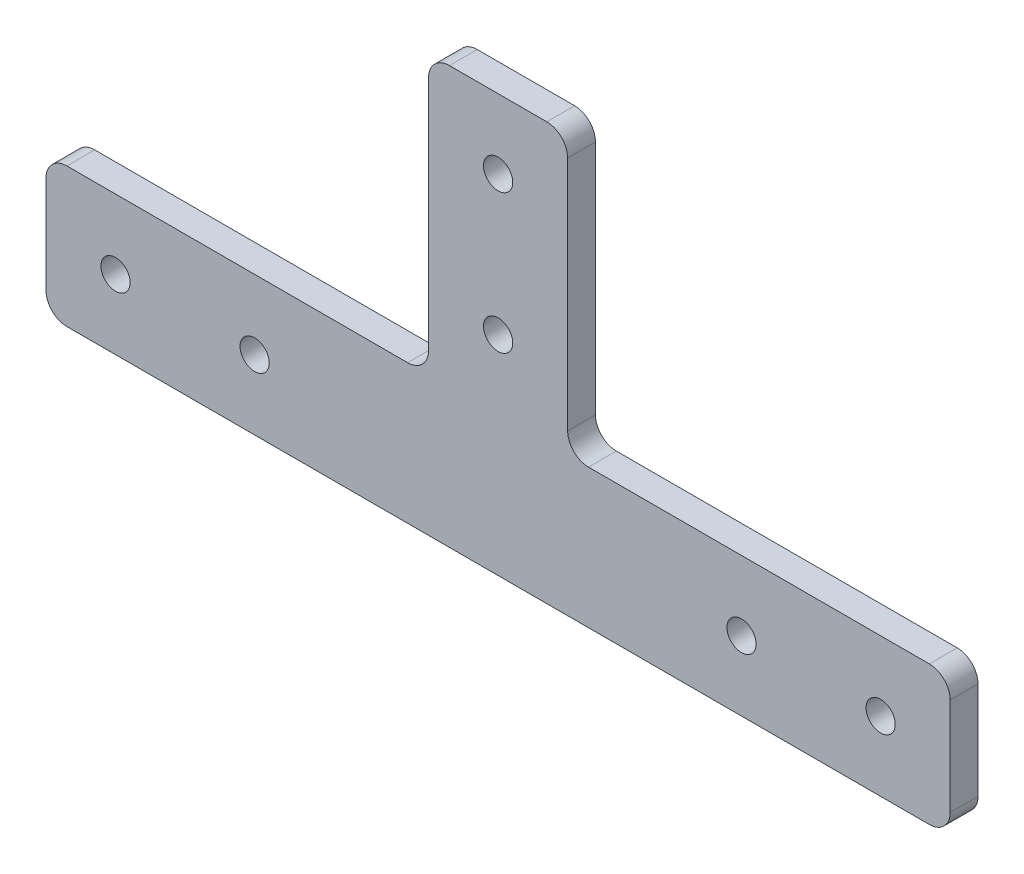
ISO-10303-21;
HEADER;
FILE_DESCRIPTION(('STEP AP214'),'2;1');
FILE_NAME('part.step','',(''),(''),'','','');
FILE_SCHEMA(('AUTOMOTIVE_DESIGN { 1 0 10303 214 1 1 1 1 }'));
ENDSEC;
DATA;
#1=APPLICATION_CONTEXT('core data for automotive mechanical design processes');
#2=APPLICATION_PROTOCOL_DEFINITION('international standard','automotive_design',2000,#1);
#3=PRODUCT_CONTEXT('',#1,'mechanical');
#4=PRODUCT('Part','Part','',(#3));
#5=PRODUCT_RELATED_PRODUCT_CATEGORY('part','',(#4));
#6=PRODUCT_DEFINITION_FORMATION('','',#4);
#7=PRODUCT_DEFINITION_CONTEXT('part definition',#1,'design');
#8=PRODUCT_DEFINITION('design','',#6,#7);
#9=PRODUCT_DEFINITION_SHAPE('','',#8);
#10=(LENGTH_UNIT() NAMED_UNIT(*) SI_UNIT(.MILLI.,.METRE.));
#11=(NAMED_UNIT(*) PLANE_ANGLE_UNIT() SI_UNIT($,.RADIAN.));
#12=(NAMED_UNIT(*) SI_UNIT($,.STERADIAN.) SOLID_ANGLE_UNIT());
#13=UNCERTAINTY_MEASURE_WITH_UNIT(LENGTH_MEASURE(1.E-05),#10,'distance_accuracy_value','');
#14=(GEOMETRIC_REPRESENTATION_CONTEXT(3) GLOBAL_UNCERTAINTY_ASSIGNED_CONTEXT((#13)) GLOBAL_UNIT_ASSIGNED_CONTEXT((#10,
#11,#12)) REPRESENTATION_CONTEXT('',''));
#15=CARTESIAN_POINT('',(0.,0.,0.));
#16=DIRECTION('',(0.,0.,1.));
#17=DIRECTION('',(1.,0.,0.));
#18=AXIS2_PLACEMENT_3D('',#15,#16,#17);
#19=CARTESIAN_POINT('',(65.,0.,4.));
#20=DIRECTION('',(1.,0.,0.));
#21=DIRECTION('',(0.,0.,-1.));
#22=AXIS2_PLACEMENT_3D('',#19,#20,#21);
#23=PLANE('',#22);
#24=DIRECTION('',(0.,-1.,0.));
#25=VECTOR('',#24,1.);
#26=CARTESIAN_POINT('',(65.,0.,4.));
#27=LINE('',#26,#25);
#28=CARTESIAN_POINT('',(65.,7.,4.));
#29=VERTEX_POINT('',#28);
#30=CARTESIAN_POINT('',(65.,-7.,4.));
#31=VERTEX_POINT('',#30);
#32=EDGE_CURVE('E336',#29,#31,#27,.T.);
#33=ORIENTED_EDGE('',*,*,#32,.T.);
#34=DIRECTION('',(0.,0.,-1.));
#35=VECTOR('',#34,1.);
#36=CARTESIAN_POINT('',(65.,-7.,0.));
#37=LINE('',#36,#35);
#38=CARTESIAN_POINT('',(65.,-7.,0.));
#39=VERTEX_POINT('',#38);
#40=EDGE_CURVE('E261',#31,#39,#37,.T.);
#41=ORIENTED_EDGE('',*,*,#40,.T.);
#42=DIRECTION('',(0.,-1.,0.));
#43=VECTOR('',#42,1.);
#44=CARTESIAN_POINT('',(65.,0.,0.));
#45=LINE('',#44,#43);
#46=CARTESIAN_POINT('',(65.,7.,0.));
#47=VERTEX_POINT('',#46);
#48=EDGE_CURVE('E314',#47,#39,#45,.T.);
#49=ORIENTED_EDGE('',*,*,#48,.F.);
#50=DIRECTION('',(0.,0.,-1.));
#51=VECTOR('',#50,1.);
#52=CARTESIAN_POINT('',(65.,7.,4.));
#53=LINE('',#52,#51);
#54=EDGE_CURVE('E258',#47,#29,#53,.F.);
#55=ORIENTED_EDGE('',*,*,#54,.T.);
#56=EDGE_LOOP('',(#33,#41,#49,#55));
#57=FACE_BOUND('',#56,.T.);
#58=ADVANCED_FACE('F45',(#57),#23,.T.);
#59=CARTESIAN_POINT('',(0.,10.,4.));
#60=DIRECTION('',(0.,1.,0.));
#61=DIRECTION('',(0.,0.,1.));
#62=AXIS2_PLACEMENT_3D('',#59,#60,#61);
#63=PLANE('',#62);
#64=DIRECTION('',(1.,0.,0.));
#65=VECTOR('',#64,1.);
#66=CARTESIAN_POINT('',(0.,10.,4.));
#67=LINE('',#66,#65);
#68=CARTESIAN_POINT('',(13.,10.,4.));
#69=VERTEX_POINT('',#68);
#70=CARTESIAN_POINT('',(62.,10.,4.));
#71=VERTEX_POINT('',#70);
#72=EDGE_CURVE('E324',#69,#71,#67,.T.);
#73=ORIENTED_EDGE('',*,*,#72,.T.);
#74=DIRECTION('',(0.,0.,-1.));
#75=VECTOR('',#74,1.);
#76=CARTESIAN_POINT('',(62.,10.,4.));
#77=LINE('',#76,#75);
#78=CARTESIAN_POINT('',(62.,10.,0.));
#79=VERTEX_POINT('',#78);
#80=EDGE_CURVE('E268',#71,#79,#77,.T.);
#81=ORIENTED_EDGE('',*,*,#80,.T.);
#82=DIRECTION('',(1.,0.,0.));
#83=VECTOR('',#82,1.);
#84=CARTESIAN_POINT('',(0.,10.,0.));
#85=LINE('',#84,#83);
#86=CARTESIAN_POINT('',(13.,10.,0.));
#87=VERTEX_POINT('',#86);
#88=EDGE_CURVE('E303',#87,#79,#85,.T.);
#89=ORIENTED_EDGE('',*,*,#88,.F.);
#90=DIRECTION('',(0.,0.,-1.));
#91=VECTOR('',#90,1.);
#92=CARTESIAN_POINT('',(13.,10.,4.));
#93=LINE('',#92,#91);
#94=EDGE_CURVE('E265',#87,#69,#93,.F.);
#95=ORIENTED_EDGE('',*,*,#94,.T.);
#96=EDGE_LOOP('',(#73,#81,#89,#95));
#97=FACE_BOUND('',#96,.T.);
#98=ADVANCED_FACE('F311',(#97),#63,.T.);
#99=CARTESIAN_POINT('',(10.,0.,4.));
#100=DIRECTION('',(1.,0.,0.));
#101=DIRECTION('',(0.,1.,0.));
#102=AXIS2_PLACEMENT_3D('',#99,#100,#101);
#103=PLANE('',#102);
#104=DIRECTION('',(0.,-1.,0.));
#105=VECTOR('',#104,1.);
#106=CARTESIAN_POINT('',(10.,0.,0.));
#107=LINE('',#106,#105);
#108=CARTESIAN_POINT('',(9.99999999999999,47.,0.));
#109=VERTEX_POINT('',#108);
#110=CARTESIAN_POINT('',(10.,13.,0.));
#111=VERTEX_POINT('',#110);
#112=EDGE_CURVE('E305',#109,#111,#107,.T.);
#113=ORIENTED_EDGE('',*,*,#112,.F.);
#114=DIRECTION('',(0.,0.,-1.));
#115=VECTOR('',#114,1.);
#116=CARTESIAN_POINT('',(9.99999999999999,47.,4.));
#117=LINE('',#116,#115);
#118=CARTESIAN_POINT('',(9.99999999999999,47.,4.));
#119=VERTEX_POINT('',#118);
#120=EDGE_CURVE('E290',#109,#119,#117,.F.);
#121=ORIENTED_EDGE('',*,*,#120,.T.);
#122=DIRECTION('',(0.,-1.,0.));
#123=VECTOR('',#122,1.);
#124=CARTESIAN_POINT('',(10.,0.,4.));
#125=LINE('',#124,#123);
#126=CARTESIAN_POINT('',(10.,13.,4.));
#127=VERTEX_POINT('',#126);
#128=EDGE_CURVE('E322',#119,#127,#125,.T.);
#129=ORIENTED_EDGE('',*,*,#128,.T.);
#130=DIRECTION('',(0.,0.,-1.));
#131=VECTOR('',#130,1.);
#132=CARTESIAN_POINT('',(10.,13.,0.));
#133=LINE('',#132,#131);
#134=EDGE_CURVE('E286',#127,#111,#133,.T.);
#135=ORIENTED_EDGE('',*,*,#134,.T.);
#136=EDGE_LOOP('',(#113,#121,#129,#135));
#137=FACE_BOUND('',#136,.T.);
#138=ADVANCED_FACE('F326',(#137),#103,.T.);
#139=CARTESIAN_POINT('',(0.,50.,4.));
#140=DIRECTION('',(0.,1.,0.));
#141=DIRECTION('',(0.,0.,1.));
#142=AXIS2_PLACEMENT_3D('',#139,#140,#141);
#143=PLANE('',#142);
#144=DIRECTION('',(1.,0.,0.));
#145=VECTOR('',#144,1.);
#146=CARTESIAN_POINT('',(0.,50.,0.));
#147=LINE('',#146,#145);
#148=CARTESIAN_POINT('',(-7.00000000000001,50.,0.));
#149=VERTEX_POINT('',#148);
#150=CARTESIAN_POINT('',(6.99999999999999,50.,0.));
#151=VERTEX_POINT('',#150);
#152=EDGE_CURVE('E376',#149,#151,#147,.T.);
#153=ORIENTED_EDGE('',*,*,#152,.F.);
#154=DIRECTION('',(0.,0.,-1.));
#155=VECTOR('',#154,1.);
#156=CARTESIAN_POINT('',(-7.00000000000001,50.,4.));
#157=LINE('',#156,#155);
#158=CARTESIAN_POINT('',(-7.00000000000001,50.,4.));
#159=VERTEX_POINT('',#158);
#160=EDGE_CURVE('E283',#149,#159,#157,.F.);
#161=ORIENTED_EDGE('',*,*,#160,.T.);
#162=DIRECTION('',(1.,0.,0.));
#163=VECTOR('',#162,1.);
#164=CARTESIAN_POINT('',(0.,50.,4.));
#165=LINE('',#164,#163);
#166=CARTESIAN_POINT('',(6.99999999999999,50.,4.));
#167=VERTEX_POINT('',#166);
#168=EDGE_CURVE('E329',#159,#167,#165,.T.);
#169=ORIENTED_EDGE('',*,*,#168,.T.);
#170=DIRECTION('',(0.,0.,-1.));
#171=VECTOR('',#170,1.);
#172=CARTESIAN_POINT('',(6.99999999999999,50.,4.));
#173=LINE('',#172,#171);
#174=EDGE_CURVE('E279',#167,#151,#173,.T.);
#175=ORIENTED_EDGE('',*,*,#174,.T.);
#176=EDGE_LOOP('',(#153,#161,#169,#175));
#177=FACE_BOUND('',#176,.T.);
#178=ADVANCED_FACE('F465',(#177),#143,.T.);
#179=CARTESIAN_POINT('',(-10.,0.,4.));
#180=DIRECTION('',(-1.,0.,0.));
#181=DIRECTION('',(0.,-1.,0.));
#182=AXIS2_PLACEMENT_3D('',#179,#180,#181);
#183=PLANE('',#182);
#184=DIRECTION('',(0.,1.,0.));
#185=VECTOR('',#184,1.);
#186=CARTESIAN_POINT('',(-10.,0.,4.));
#187=LINE('',#186,#185);
#188=CARTESIAN_POINT('',(-10.,13.,4.));
#189=VERTEX_POINT('',#188);
#190=CARTESIAN_POINT('',(-10.,47.,4.));
#191=VERTEX_POINT('',#190);
#192=EDGE_CURVE('E334',#189,#191,#187,.T.);
#193=ORIENTED_EDGE('',*,*,#192,.T.);
#194=DIRECTION('',(0.,0.,-1.));
#195=VECTOR('',#194,1.);
#196=CARTESIAN_POINT('',(-10.,47.,4.));
#197=LINE('',#196,#195);
#198=CARTESIAN_POINT('',(-10.,47.,0.));
#199=VERTEX_POINT('',#198);
#200=EDGE_CURVE('E275',#191,#199,#197,.T.);
#201=ORIENTED_EDGE('',*,*,#200,.T.);
#202=DIRECTION('',(0.,1.,0.));
#203=VECTOR('',#202,1.);
#204=CARTESIAN_POINT('',(-10.,0.,0.));
#205=LINE('',#204,#203);
#206=CARTESIAN_POINT('',(-10.,13.,0.));
#207=VERTEX_POINT('',#206);
#208=EDGE_CURVE('E379',#207,#199,#205,.T.);
#209=ORIENTED_EDGE('',*,*,#208,.F.);
#210=DIRECTION('',(0.,0.,-1.));
#211=VECTOR('',#210,1.);
#212=CARTESIAN_POINT('',(-10.,13.,4.));
#213=LINE('',#212,#211);
#214=EDGE_CURVE('E272',#207,#189,#213,.F.);
#215=ORIENTED_EDGE('',*,*,#214,.T.);
#216=EDGE_LOOP('',(#193,#201,#209,#215));
#217=FACE_BOUND('',#216,.T.);
#218=ADVANCED_FACE('F406',(#217),#183,.T.);
#219=CARTESIAN_POINT('',(-62.,10.,0.));
#220=VERTEX_POINT('',#219);
#221=CARTESIAN_POINT('',(-13.,10.,0.));
#222=VERTEX_POINT('',#221);
#223=EDGE_CURVE('E202',#220,#222,#85,.T.);
#224=ORIENTED_EDGE('',*,*,#223,.F.);
#225=DIRECTION('',(0.,0.,-1.));
#226=VECTOR('',#225,1.);
#227=CARTESIAN_POINT('',(-62.,10.,4.));
#228=LINE('',#227,#226);
#229=CARTESIAN_POINT('',(-62.,10.,4.));
#230=VERTEX_POINT('',#229);
#231=EDGE_CURVE('E68',#220,#230,#228,.F.);
#232=ORIENTED_EDGE('',*,*,#231,.T.);
#233=CARTESIAN_POINT('',(-13.,10.,4.));
#234=VERTEX_POINT('',#233);
#235=EDGE_CURVE('E338',#230,#234,#67,.T.);
#236=ORIENTED_EDGE('',*,*,#235,.T.);
#237=DIRECTION('',(0.,0.,-1.));
#238=VECTOR('',#237,1.);
#239=CARTESIAN_POINT('',(-13.,10.,0.));
#240=LINE('',#239,#238);
#241=EDGE_CURVE('E252',#234,#222,#240,.T.);
#242=ORIENTED_EDGE('',*,*,#241,.T.);
#243=EDGE_LOOP('',(#224,#232,#236,#242));
#244=FACE_BOUND('',#243,.T.);
#245=ADVANCED_FACE('F387',(#244),#63,.T.);
#246=CARTESIAN_POINT('',(-65.,0.,4.));
#247=DIRECTION('',(1.,0.,0.));
#248=DIRECTION('',(0.,0.,-1.));
#249=AXIS2_PLACEMENT_3D('',#246,#247,#248);
#250=PLANE('',#249);
#251=DIRECTION('',(0.,-1.,0.));
#252=VECTOR('',#251,1.);
#253=CARTESIAN_POINT('',(-65.,0.,0.));
#254=LINE('',#253,#252);
#255=CARTESIAN_POINT('',(-65.,7.,0.));
#256=VERTEX_POINT('',#255);
#257=CARTESIAN_POINT('',(-65.,-7.,0.));
#258=VERTEX_POINT('',#257);
#259=EDGE_CURVE('E192',#256,#258,#254,.T.);
#260=ORIENTED_EDGE('',*,*,#259,.T.);
#261=DIRECTION('',(0.,0.,-1.));
#262=VECTOR('',#261,1.);
#263=CARTESIAN_POINT('',(-65.,-7.,4.));
#264=LINE('',#263,#262);
#265=CARTESIAN_POINT('',(-65.,-7.,4.));
#266=VERTEX_POINT('',#265);
#267=EDGE_CURVE('E165',#258,#266,#264,.F.);
#268=ORIENTED_EDGE('',*,*,#267,.T.);
#269=DIRECTION('',(0.,-1.,0.));
#270=VECTOR('',#269,1.);
#271=CARTESIAN_POINT('',(-65.,0.,4.));
#272=LINE('',#271,#270);
#273=CARTESIAN_POINT('',(-65.,7.,4.));
#274=VERTEX_POINT('',#273);
#275=EDGE_CURVE('E344',#274,#266,#272,.T.);
#276=ORIENTED_EDGE('',*,*,#275,.F.);
#277=DIRECTION('',(0.,0.,-1.));
#278=VECTOR('',#277,1.);
#279=CARTESIAN_POINT('',(-65.,7.,0.));
#280=LINE('',#279,#278);
#281=EDGE_CURVE('E171',#274,#256,#280,.T.);
#282=ORIENTED_EDGE('',*,*,#281,.T.);
#283=EDGE_LOOP('',(#260,#268,#276,#282));
#284=FACE_BOUND('',#283,.T.);
#285=ADVANCED_FACE('F395',(#284),#250,.F.);
#286=CARTESIAN_POINT('',(0.,20.,4.));
#287=DIRECTION('',(0.,0.,-1.));
#288=DIRECTION('',(-1.,0.,0.));
#289=AXIS2_PLACEMENT_3D('',#286,#287,#288);
#290=CYLINDRICAL_SURFACE('',#289,2.1);
#291=CARTESIAN_POINT('',(0.,20.,4.));
#292=DIRECTION('',(0.,0.,1.));
#293=DIRECTION('',(1.,0.,0.));
#294=AXIS2_PLACEMENT_3D('',#291,#292,#293);
#295=CIRCLE('',#294,2.1);
#296=CARTESIAN_POINT('',(2.09999999999999,20.,4.));
#297=VERTEX_POINT('',#296);
#298=EDGE_CURVE('E353',#297,#297,#295,.T.);
#299=ORIENTED_EDGE('',*,*,#298,.T.);
#300=EDGE_LOOP('',(#299));
#301=FACE_BOUND('',#300,.T.);
#302=CARTESIAN_POINT('',(0.,20.,0.));
#303=DIRECTION('',(0.,0.,1.));
#304=DIRECTION('',(1.,0.,0.));
#305=AXIS2_PLACEMENT_3D('',#302,#303,#304);
#306=CIRCLE('',#305,2.1);
#307=CARTESIAN_POINT('',(2.09999999999999,20.,0.));
#308=VERTEX_POINT('',#307);
#309=EDGE_CURVE('E199',#308,#308,#306,.T.);
#310=ORIENTED_EDGE('',*,*,#309,.F.);
#311=EDGE_LOOP('',(#310));
#312=FACE_BOUND('',#311,.T.);
#313=ADVANCED_FACE('F397',(#301,#312),#290,.F.);
#314=CARTESIAN_POINT('',(55.,0.,4.));
#315=DIRECTION('',(0.,0.,-1.));
#316=DIRECTION('',(-1.,0.,0.));
#317=AXIS2_PLACEMENT_3D('',#314,#315,#316);
#318=CYLINDRICAL_SURFACE('',#317,2.1);
#319=CARTESIAN_POINT('',(55.,0.,4.));
#320=DIRECTION('',(0.,0.,1.));
#321=DIRECTION('',(1.,0.,0.));
#322=AXIS2_PLACEMENT_3D('',#319,#320,#321);
#323=CIRCLE('',#322,2.1);
#324=CARTESIAN_POINT('',(57.1,0.,4.));
#325=VERTEX_POINT('',#324);
#326=EDGE_CURVE('E349',#325,#325,#323,.F.);
#327=ORIENTED_EDGE('',*,*,#326,.F.);
#328=EDGE_LOOP('',(#327));
#329=FACE_BOUND('',#328,.T.);
#330=CARTESIAN_POINT('',(55.,0.,0.));
#331=DIRECTION('',(0.,0.,1.));
#332=DIRECTION('',(1.,0.,0.));
#333=AXIS2_PLACEMENT_3D('',#330,#331,#332);
#334=CIRCLE('',#333,2.1);
#335=CARTESIAN_POINT('',(57.1,0.,0.));
#336=VERTEX_POINT('',#335);
#337=EDGE_CURVE('E191',#336,#336,#334,.F.);
#338=ORIENTED_EDGE('',*,*,#337,.T.);
#339=EDGE_LOOP('',(#338));
#340=FACE_BOUND('',#339,.T.);
#341=ADVANCED_FACE('F403',(#329,#340),#318,.F.);
#342=CARTESIAN_POINT('',(0.,-10.,4.));
#343=DIRECTION('',(0.,1.,0.));
#344=DIRECTION('',(0.,0.,1.));
#345=AXIS2_PLACEMENT_3D('',#342,#343,#344);
#346=PLANE('',#345);
#347=DIRECTION('',(1.,0.,0.));
#348=VECTOR('',#347,1.);
#349=CARTESIAN_POINT('',(0.,-10.,4.));
#350=LINE('',#349,#348);
#351=CARTESIAN_POINT('',(-62.,-10.,4.));
#352=VERTEX_POINT('',#351);
#353=CARTESIAN_POINT('',(62.,-10.,4.));
#354=VERTEX_POINT('',#353);
#355=EDGE_CURVE('E181',#352,#354,#350,.T.);
#356=ORIENTED_EDGE('',*,*,#355,.F.);
#357=DIRECTION('',(0.,0.,-1.));
#358=VECTOR('',#357,1.);
#359=CARTESIAN_POINT('',(-62.,-10.,4.));
#360=LINE('',#359,#358);
#361=CARTESIAN_POINT('',(-62.,-10.,0.));
#362=VERTEX_POINT('',#361);
#363=EDGE_CURVE('E164',#352,#362,#360,.T.);
#364=ORIENTED_EDGE('',*,*,#363,.T.);
#365=DIRECTION('',(1.,0.,0.));
#366=VECTOR('',#365,1.);
#367=CARTESIAN_POINT('',(0.,-10.,0.));
#368=LINE('',#367,#366);
#369=CARTESIAN_POINT('',(62.,-10.,0.));
#370=VERTEX_POINT('',#369);
#371=EDGE_CURVE('E178',#362,#370,#368,.T.);
#372=ORIENTED_EDGE('',*,*,#371,.T.);
#373=DIRECTION('',(0.,0.,-1.));
#374=VECTOR('',#373,1.);
#375=CARTESIAN_POINT('',(62.,-10.,4.));
#376=LINE('',#375,#374);
#377=EDGE_CURVE('E184',#370,#354,#376,.F.);
#378=ORIENTED_EDGE('',*,*,#377,.T.);
#379=EDGE_LOOP('',(#356,#364,#372,#378));
#380=FACE_BOUND('',#379,.T.);
#381=ADVANCED_FACE('F177',(#380),#346,.F.);
#382=CARTESIAN_POINT('',(-55.,0.,4.));
#383=DIRECTION('',(0.,0.,-1.));
#384=DIRECTION('',(-1.,0.,0.));
#385=AXIS2_PLACEMENT_3D('',#382,#383,#384);
#386=CYLINDRICAL_SURFACE('',#385,2.1);
#387=CARTESIAN_POINT('',(-55.,0.,4.));
#388=DIRECTION('',(0.,0.,1.));
#389=DIRECTION('',(1.,0.,0.));
#390=AXIS2_PLACEMENT_3D('',#387,#388,#389);
#391=CIRCLE('',#390,2.1);
#392=CARTESIAN_POINT('',(-52.9,0.,4.));
#393=VERTEX_POINT('',#392);
#394=EDGE_CURVE('E669',#393,#393,#391,.T.);
#395=ORIENTED_EDGE('',*,*,#394,.T.);
#396=EDGE_LOOP('',(#395));
#397=FACE_BOUND('',#396,.T.);
#398=CARTESIAN_POINT('',(-55.,0.,0.));
#399=DIRECTION('',(0.,0.,1.));
#400=DIRECTION('',(1.,0.,0.));
#401=AXIS2_PLACEMENT_3D('',#398,#399,#400);
#402=CIRCLE('',#401,2.1);
#403=CARTESIAN_POINT('',(-52.9,0.,0.));
#404=VERTEX_POINT('',#403);
#405=EDGE_CURVE('E368',#404,#404,#402,.T.);
#406=ORIENTED_EDGE('',*,*,#405,.F.);
#407=EDGE_LOOP('',(#406));
#408=FACE_BOUND('',#407,.T.);
#409=ADVANCED_FACE('F419',(#397,#408),#386,.F.);
#410=CARTESIAN_POINT('',(-35.,0.,4.));
#411=DIRECTION('',(0.,0.,-1.));
#412=DIRECTION('',(-1.,0.,0.));
#413=AXIS2_PLACEMENT_3D('',#410,#411,#412);
#414=CYLINDRICAL_SURFACE('',#413,2.1);
#415=CARTESIAN_POINT('',(-35.,0.,4.));
#416=DIRECTION('',(0.,0.,1.));
#417=DIRECTION('',(1.,0.,0.));
#418=AXIS2_PLACEMENT_3D('',#415,#416,#417);
#419=CIRCLE('',#418,2.1);
#420=CARTESIAN_POINT('',(-32.9,0.,4.));
#421=VERTEX_POINT('',#420);
#422=EDGE_CURVE('E666',#421,#421,#419,.T.);
#423=ORIENTED_EDGE('',*,*,#422,.T.);
#424=EDGE_LOOP('',(#423));
#425=FACE_BOUND('',#424,.T.);
#426=CARTESIAN_POINT('',(-35.,0.,0.));
#427=DIRECTION('',(0.,0.,1.));
#428=DIRECTION('',(1.,0.,0.));
#429=AXIS2_PLACEMENT_3D('',#426,#427,#428);
#430=CIRCLE('',#429,2.1);
#431=CARTESIAN_POINT('',(-32.9,0.,0.));
#432=VERTEX_POINT('',#431);
#433=EDGE_CURVE('E364',#432,#432,#430,.T.);
#434=ORIENTED_EDGE('',*,*,#433,.F.);
#435=EDGE_LOOP('',(#434));
#436=FACE_BOUND('',#435,.T.);
#437=ADVANCED_FACE('F422',(#425,#436),#414,.F.);
#438=CARTESIAN_POINT('',(35.,0.,4.));
#439=DIRECTION('',(0.,0.,-1.));
#440=DIRECTION('',(-1.,0.,0.));
#441=AXIS2_PLACEMENT_3D('',#438,#439,#440);
#442=CYLINDRICAL_SURFACE('',#441,2.1);
#443=CARTESIAN_POINT('',(35.,0.,4.));
#444=DIRECTION('',(0.,0.,1.));
#445=DIRECTION('',(1.,0.,0.));
#446=AXIS2_PLACEMENT_3D('',#443,#444,#445);
#447=CIRCLE('',#446,2.1);
#448=CARTESIAN_POINT('',(37.1,0.,4.));
#449=VERTEX_POINT('',#448);
#450=EDGE_CURVE('E213',#449,#449,#447,.F.);
#451=ORIENTED_EDGE('',*,*,#450,.F.);
#452=EDGE_LOOP('',(#451));
#453=FACE_BOUND('',#452,.T.);
#454=CARTESIAN_POINT('',(35.,0.,0.));
#455=DIRECTION('',(0.,0.,1.));
#456=DIRECTION('',(1.,0.,0.));
#457=AXIS2_PLACEMENT_3D('',#454,#455,#456);
#458=CIRCLE('',#457,2.1);
#459=CARTESIAN_POINT('',(37.1,0.,0.));
#460=VERTEX_POINT('',#459);
#461=EDGE_CURVE('E360',#460,#460,#458,.F.);
#462=ORIENTED_EDGE('',*,*,#461,.T.);
#463=EDGE_LOOP('',(#462));
#464=FACE_BOUND('',#463,.T.);
#465=ADVANCED_FACE('F426',(#453,#464),#442,.F.);
#466=CARTESIAN_POINT('',(0.,40.,4.));
#467=DIRECTION('',(0.,0.,-1.));
#468=DIRECTION('',(-1.,0.,0.));
#469=AXIS2_PLACEMENT_3D('',#466,#467,#468);
#470=CYLINDRICAL_SURFACE('',#469,2.1);
#471=CARTESIAN_POINT('',(0.,40.,4.));
#472=DIRECTION('',(0.,0.,1.));
#473=DIRECTION('',(1.,0.,0.));
#474=AXIS2_PLACEMENT_3D('',#471,#472,#473);
#475=CIRCLE('',#474,2.1);
#476=CARTESIAN_POINT('',(2.09999999999999,40.,4.));
#477=VERTEX_POINT('',#476);
#478=EDGE_CURVE('E215',#477,#477,#475,.T.);
#479=ORIENTED_EDGE('',*,*,#478,.T.);
#480=EDGE_LOOP('',(#479));
#481=FACE_BOUND('',#480,.T.);
#482=CARTESIAN_POINT('',(0.,40.,0.));
#483=DIRECTION('',(0.,0.,1.));
#484=DIRECTION('',(1.,0.,0.));
#485=AXIS2_PLACEMENT_3D('',#482,#483,#484);
#486=CIRCLE('',#485,2.1);
#487=CARTESIAN_POINT('',(2.09999999999999,40.,0.));
#488=VERTEX_POINT('',#487);
#489=EDGE_CURVE('E209',#488,#488,#486,.T.);
#490=ORIENTED_EDGE('',*,*,#489,.F.);
#491=EDGE_LOOP('',(#490));
#492=FACE_BOUND('',#491,.T.);
#493=ADVANCED_FACE('F430',(#481,#492),#470,.F.);
#494=CARTESIAN_POINT('',(0.,0.,4.));
#495=DIRECTION('',(0.,0.,1.));
#496=DIRECTION('',(1.,0.,0.));
#497=AXIS2_PLACEMENT_3D('',#494,#495,#496);
#498=PLANE('',#497);
#499=ORIENTED_EDGE('',*,*,#450,.T.);
#500=EDGE_LOOP('',(#499));
#501=FACE_BOUND('',#500,.T.);
#502=ORIENTED_EDGE('',*,*,#422,.F.);
#503=EDGE_LOOP('',(#502));
#504=FACE_BOUND('',#503,.T.);
#505=ORIENTED_EDGE('',*,*,#394,.F.);
#506=EDGE_LOOP('',(#505));
#507=FACE_BOUND('',#506,.T.);
#508=ORIENTED_EDGE('',*,*,#275,.T.);
#509=CARTESIAN_POINT('',(-62.,-7.,4.));
#510=DIRECTION('',(0.,0.,1.));
#511=DIRECTION('',(1.,0.,0.));
#512=AXIS2_PLACEMENT_3D('',#509,#510,#511);
#513=CIRCLE('',#512,3.);
#514=EDGE_CURVE('E249',#266,#352,#513,.T.);
#515=ORIENTED_EDGE('',*,*,#514,.T.);
#516=ORIENTED_EDGE('',*,*,#355,.T.);
#517=CARTESIAN_POINT('',(62.,-7.,4.));
#518=DIRECTION('',(0.,0.,1.));
#519=DIRECTION('',(1.,0.,0.));
#520=AXIS2_PLACEMENT_3D('',#517,#518,#519);
#521=CIRCLE('',#520,3.);
#522=EDGE_CURVE('E243',#354,#31,#521,.T.);
#523=ORIENTED_EDGE('',*,*,#522,.T.);
#524=ORIENTED_EDGE('',*,*,#32,.F.);
#525=CARTESIAN_POINT('',(62.,7.,4.));
#526=DIRECTION('',(0.,0.,1.));
#527=DIRECTION('',(1.,0.,0.));
#528=AXIS2_PLACEMENT_3D('',#525,#526,#527);
#529=CIRCLE('',#528,3.);
#530=EDGE_CURVE('E240',#29,#71,#529,.T.);
#531=ORIENTED_EDGE('',*,*,#530,.T.);
#532=ORIENTED_EDGE('',*,*,#72,.F.);
#533=CARTESIAN_POINT('',(13.,13.,4.));
#534=DIRECTION('',(0.,0.,1.));
#535=DIRECTION('',(1.,0.,0.));
#536=AXIS2_PLACEMENT_3D('',#533,#534,#535);
#537=CIRCLE('',#536,3.);
#538=EDGE_CURVE('E11',#69,#127,#537,.F.);
#539=ORIENTED_EDGE('',*,*,#538,.T.);
#540=ORIENTED_EDGE('',*,*,#128,.F.);
#541=CARTESIAN_POINT('',(6.99999999999999,47.,4.));
#542=DIRECTION('',(0.,0.,1.));
#543=DIRECTION('',(1.,0.,0.));
#544=AXIS2_PLACEMENT_3D('',#541,#542,#543);
#545=CIRCLE('',#544,3.);
#546=EDGE_CURVE('E234',#119,#167,#545,.T.);
#547=ORIENTED_EDGE('',*,*,#546,.T.);
#548=ORIENTED_EDGE('',*,*,#168,.F.);
#549=CARTESIAN_POINT('',(-7.00000000000001,47.,4.));
#550=DIRECTION('',(0.,0.,1.));
#551=DIRECTION('',(1.,0.,0.));
#552=AXIS2_PLACEMENT_3D('',#549,#550,#551);
#553=CIRCLE('',#552,3.);
#554=EDGE_CURVE('E237',#159,#191,#553,.T.);
#555=ORIENTED_EDGE('',*,*,#554,.T.);
#556=ORIENTED_EDGE('',*,*,#192,.F.);
#557=CARTESIAN_POINT('',(-13.,13.,4.));
#558=DIRECTION('',(0.,0.,1.));
#559=DIRECTION('',(1.,0.,0.));
#560=AXIS2_PLACEMENT_3D('',#557,#558,#559);
#561=CIRCLE('',#560,3.);
#562=EDGE_CURVE('E61',#189,#234,#561,.F.);
#563=ORIENTED_EDGE('',*,*,#562,.T.);
#564=ORIENTED_EDGE('',*,*,#235,.F.);
#565=CARTESIAN_POINT('',(-62.,7.,4.));
#566=DIRECTION('',(0.,0.,1.));
#567=DIRECTION('',(1.,0.,0.));
#568=AXIS2_PLACEMENT_3D('',#565,#566,#567);
#569=CIRCLE('',#568,3.);
#570=EDGE_CURVE('E246',#230,#274,#569,.T.);
#571=ORIENTED_EDGE('',*,*,#570,.T.);
#572=EDGE_LOOP('',(#508,#515,#516,#523,#524,#531,#532,#539,#540,#547,#548,#555,#556,#563,#564,#571));
#573=FACE_BOUND('',#572,.T.);
#574=ORIENTED_EDGE('',*,*,#326,.T.);
#575=EDGE_LOOP('',(#574));
#576=FACE_BOUND('',#575,.T.);
#577=ORIENTED_EDGE('',*,*,#298,.F.);
#578=EDGE_LOOP('',(#577));
#579=FACE_BOUND('',#578,.T.);
#580=ORIENTED_EDGE('',*,*,#478,.F.);
#581=EDGE_LOOP('',(#580));
#582=FACE_BOUND('',#581,.T.);
#583=ADVANCED_FACE('F320',(#501,#504,#507,#573,#576,#579,#582),#498,.T.);
#584=CARTESIAN_POINT('',(0.,0.,0.));
#585=DIRECTION('',(0.,0.,1.));
#586=DIRECTION('',(1.,0.,0.));
#587=AXIS2_PLACEMENT_3D('',#584,#585,#586);
#588=PLANE('',#587);
#589=ORIENTED_EDGE('',*,*,#461,.F.);
#590=EDGE_LOOP('',(#589));
#591=FACE_BOUND('',#590,.T.);
#592=ORIENTED_EDGE('',*,*,#433,.T.);
#593=EDGE_LOOP('',(#592));
#594=FACE_BOUND('',#593,.T.);
#595=ORIENTED_EDGE('',*,*,#405,.T.);
#596=EDGE_LOOP('',(#595));
#597=FACE_BOUND('',#596,.T.);
#598=ORIENTED_EDGE('',*,*,#371,.F.);
#599=CARTESIAN_POINT('',(-62.,-7.,0.));
#600=DIRECTION('',(0.,0.,1.));
#601=DIRECTION('',(1.,0.,0.));
#602=AXIS2_PLACEMENT_3D('',#599,#600,#601);
#603=CIRCLE('',#602,3.);
#604=EDGE_CURVE('E160',#362,#258,#603,.F.);
#605=ORIENTED_EDGE('',*,*,#604,.T.);
#606=ORIENTED_EDGE('',*,*,#259,.F.);
#607=CARTESIAN_POINT('',(-62.,7.,0.));
#608=DIRECTION('',(0.,0.,1.));
#609=DIRECTION('',(1.,0.,0.));
#610=AXIS2_PLACEMENT_3D('',#607,#608,#609);
#611=CIRCLE('',#610,3.);
#612=EDGE_CURVE('E172',#256,#220,#611,.F.);
#613=ORIENTED_EDGE('',*,*,#612,.T.);
#614=ORIENTED_EDGE('',*,*,#223,.T.);
#615=CARTESIAN_POINT('',(-13.,13.,0.));
#616=DIRECTION('',(0.,0.,1.));
#617=DIRECTION('',(1.,0.,0.));
#618=AXIS2_PLACEMENT_3D('',#615,#616,#617);
#619=CIRCLE('',#618,3.);
#620=EDGE_CURVE('E293',#222,#207,#619,.T.);
#621=ORIENTED_EDGE('',*,*,#620,.T.);
#622=ORIENTED_EDGE('',*,*,#208,.T.);
#623=CARTESIAN_POINT('',(-7.00000000000001,47.,0.));
#624=DIRECTION('',(0.,0.,1.));
#625=DIRECTION('',(1.,0.,0.));
#626=AXIS2_PLACEMENT_3D('',#623,#624,#625);
#627=CIRCLE('',#626,3.);
#628=EDGE_CURVE('E219',#199,#149,#627,.F.);
#629=ORIENTED_EDGE('',*,*,#628,.T.);
#630=ORIENTED_EDGE('',*,*,#152,.T.);
#631=CARTESIAN_POINT('',(6.99999999999999,47.,0.));
#632=DIRECTION('',(0.,0.,1.));
#633=DIRECTION('',(1.,0.,0.));
#634=AXIS2_PLACEMENT_3D('',#631,#632,#633);
#635=CIRCLE('',#634,3.);
#636=EDGE_CURVE('E183',#151,#109,#635,.F.);
#637=ORIENTED_EDGE('',*,*,#636,.T.);
#638=ORIENTED_EDGE('',*,*,#112,.T.);
#639=CARTESIAN_POINT('',(13.,13.,0.));
#640=DIRECTION('',(0.,0.,1.));
#641=DIRECTION('',(1.,0.,0.));
#642=AXIS2_PLACEMENT_3D('',#639,#640,#641);
#643=CIRCLE('',#642,3.);
#644=EDGE_CURVE('E54',#111,#87,#643,.T.);
#645=ORIENTED_EDGE('',*,*,#644,.T.);
#646=ORIENTED_EDGE('',*,*,#88,.T.);
#647=CARTESIAN_POINT('',(62.,7.,0.));
#648=DIRECTION('',(0.,0.,1.));
#649=DIRECTION('',(1.,0.,0.));
#650=AXIS2_PLACEMENT_3D('',#647,#648,#649);
#651=CIRCLE('',#650,3.);
#652=EDGE_CURVE('E222',#79,#47,#651,.F.);
#653=ORIENTED_EDGE('',*,*,#652,.T.);
#654=ORIENTED_EDGE('',*,*,#48,.T.);
#655=CARTESIAN_POINT('',(62.,-7.,0.));
#656=DIRECTION('',(0.,0.,1.));
#657=DIRECTION('',(1.,0.,0.));
#658=AXIS2_PLACEMENT_3D('',#655,#656,#657);
#659=CIRCLE('',#658,3.);
#660=EDGE_CURVE('E189',#39,#370,#659,.F.);
#661=ORIENTED_EDGE('',*,*,#660,.T.);
#662=EDGE_LOOP('',(#598,#605,#606,#613,#614,#621,#622,#629,#630,#637,#638,#645,#646,#653,#654,#661));
#663=FACE_BOUND('',#662,.T.);
#664=ORIENTED_EDGE('',*,*,#337,.F.);
#665=EDGE_LOOP('',(#664));
#666=FACE_BOUND('',#665,.T.);
#667=ORIENTED_EDGE('',*,*,#309,.T.);
#668=EDGE_LOOP('',(#667));
#669=FACE_BOUND('',#668,.T.);
#670=ORIENTED_EDGE('',*,*,#489,.T.);
#671=EDGE_LOOP('',(#670));
#672=FACE_BOUND('',#671,.T.);
#673=ADVANCED_FACE('F186',(#591,#594,#597,#663,#666,#669,#672),#588,.F.);
#674=CARTESIAN_POINT('',(-62.,-7.,4.));
#675=DIRECTION('',(0.,0.,-1.));
#676=DIRECTION('',(-1.,0.,0.));
#677=AXIS2_PLACEMENT_3D('',#674,#675,#676);
#678=CYLINDRICAL_SURFACE('',#677,3.);
#679=ORIENTED_EDGE('',*,*,#514,.F.);
#680=ORIENTED_EDGE('',*,*,#267,.F.);
#681=ORIENTED_EDGE('',*,*,#604,.F.);
#682=ORIENTED_EDGE('',*,*,#363,.F.);
#683=EDGE_LOOP('',(#679,#680,#681,#682));
#684=FACE_BOUND('',#683,.T.);
#685=ADVANCED_FACE('F163',(#684),#678,.T.);
#686=CARTESIAN_POINT('',(-62.,7.,4.));
#687=DIRECTION('',(0.,0.,1.));
#688=DIRECTION('',(1.,0.,0.));
#689=AXIS2_PLACEMENT_3D('',#686,#687,#688);
#690=CYLINDRICAL_SURFACE('',#689,3.);
#691=ORIENTED_EDGE('',*,*,#570,.F.);
#692=ORIENTED_EDGE('',*,*,#231,.F.);
#693=ORIENTED_EDGE('',*,*,#612,.F.);
#694=ORIENTED_EDGE('',*,*,#281,.F.);
#695=EDGE_LOOP('',(#691,#692,#693,#694));
#696=FACE_BOUND('',#695,.T.);
#697=ADVANCED_FACE('F391',(#696),#690,.T.);
#698=CARTESIAN_POINT('',(62.,-7.,4.));
#699=DIRECTION('',(0.,0.,1.));
#700=DIRECTION('',(1.,0.,0.));
#701=AXIS2_PLACEMENT_3D('',#698,#699,#700);
#702=CYLINDRICAL_SURFACE('',#701,3.);
#703=ORIENTED_EDGE('',*,*,#522,.F.);
#704=ORIENTED_EDGE('',*,*,#377,.F.);
#705=ORIENTED_EDGE('',*,*,#660,.F.);
#706=ORIENTED_EDGE('',*,*,#40,.F.);
#707=EDGE_LOOP('',(#703,#704,#705,#706));
#708=FACE_BOUND('',#707,.T.);
#709=ADVANCED_FACE('F436',(#708),#702,.T.);
#710=CARTESIAN_POINT('',(62.,7.,4.));
#711=DIRECTION('',(0.,0.,-1.));
#712=DIRECTION('',(-1.,0.,0.));
#713=AXIS2_PLACEMENT_3D('',#710,#711,#712);
#714=CYLINDRICAL_SURFACE('',#713,3.);
#715=ORIENTED_EDGE('',*,*,#530,.F.);
#716=ORIENTED_EDGE('',*,*,#54,.F.);
#717=ORIENTED_EDGE('',*,*,#652,.F.);
#718=ORIENTED_EDGE('',*,*,#80,.F.);
#719=EDGE_LOOP('',(#715,#716,#717,#718));
#720=FACE_BOUND('',#719,.T.);
#721=ADVANCED_FACE('F439',(#720),#714,.T.);
#722=CARTESIAN_POINT('',(-7.00000000000001,47.,4.));
#723=DIRECTION('',(0.,0.,-1.));
#724=DIRECTION('',(-1.,0.,0.));
#725=AXIS2_PLACEMENT_3D('',#722,#723,#724);
#726=CYLINDRICAL_SURFACE('',#725,3.);
#727=ORIENTED_EDGE('',*,*,#554,.F.);
#728=ORIENTED_EDGE('',*,*,#160,.F.);
#729=ORIENTED_EDGE('',*,*,#628,.F.);
#730=ORIENTED_EDGE('',*,*,#200,.F.);
#731=EDGE_LOOP('',(#727,#728,#729,#730));
#732=FACE_BOUND('',#731,.T.);
#733=ADVANCED_FACE('F443',(#732),#726,.T.);
#734=CARTESIAN_POINT('',(6.99999999999999,47.,4.));
#735=DIRECTION('',(0.,0.,-1.));
#736=DIRECTION('',(-1.,0.,0.));
#737=AXIS2_PLACEMENT_3D('',#734,#735,#736);
#738=CYLINDRICAL_SURFACE('',#737,3.);
#739=ORIENTED_EDGE('',*,*,#546,.F.);
#740=ORIENTED_EDGE('',*,*,#120,.F.);
#741=ORIENTED_EDGE('',*,*,#636,.F.);
#742=ORIENTED_EDGE('',*,*,#174,.F.);
#743=EDGE_LOOP('',(#739,#740,#741,#742));
#744=FACE_BOUND('',#743,.T.);
#745=ADVANCED_FACE('F447',(#744),#738,.T.);
#746=CARTESIAN_POINT('',(-13.,13.,4.));
#747=DIRECTION('',(0.,0.,1.));
#748=DIRECTION('',(1.,0.,0.));
#749=AXIS2_PLACEMENT_3D('',#746,#747,#748);
#750=CYLINDRICAL_SURFACE('',#749,3.);
#751=ORIENTED_EDGE('',*,*,#562,.F.);
#752=ORIENTED_EDGE('',*,*,#214,.F.);
#753=ORIENTED_EDGE('',*,*,#620,.F.);
#754=ORIENTED_EDGE('',*,*,#241,.F.);
#755=EDGE_LOOP('',(#751,#752,#753,#754));
#756=FACE_BOUND('',#755,.T.);
#757=ADVANCED_FACE('F450',(#756),#750,.F.);
#758=CARTESIAN_POINT('',(13.,13.,4.));
#759=DIRECTION('',(0.,0.,1.));
#760=DIRECTION('',(1.,0.,0.));
#761=AXIS2_PLACEMENT_3D('',#758,#759,#760);
#762=CYLINDRICAL_SURFACE('',#761,3.);
#763=ORIENTED_EDGE('',*,*,#538,.F.);
#764=ORIENTED_EDGE('',*,*,#94,.F.);
#765=ORIENTED_EDGE('',*,*,#644,.F.);
#766=ORIENTED_EDGE('',*,*,#134,.F.);
#767=EDGE_LOOP('',(#763,#764,#765,#766));
#768=FACE_BOUND('',#767,.T.);
#769=ADVANCED_FACE('F47',(#768),#762,.F.);
#770=CLOSED_SHELL('',(#58,#98,#138,#178,#218,#245,#285,#313,#341,#381,#409,#437,#465,#493,#583,
#673,#685,#697,#709,#721,#733,#745,#757,#769));
#771=MANIFOLD_SOLID_BREP('B2',#770);
#772=ADVANCED_BREP_SHAPE_REPRESENTATION('',(#18,#771),#14);
#773=SHAPE_DEFINITION_REPRESENTATION(#9,#772);
ENDSEC;
END-ISO-10303-21;
